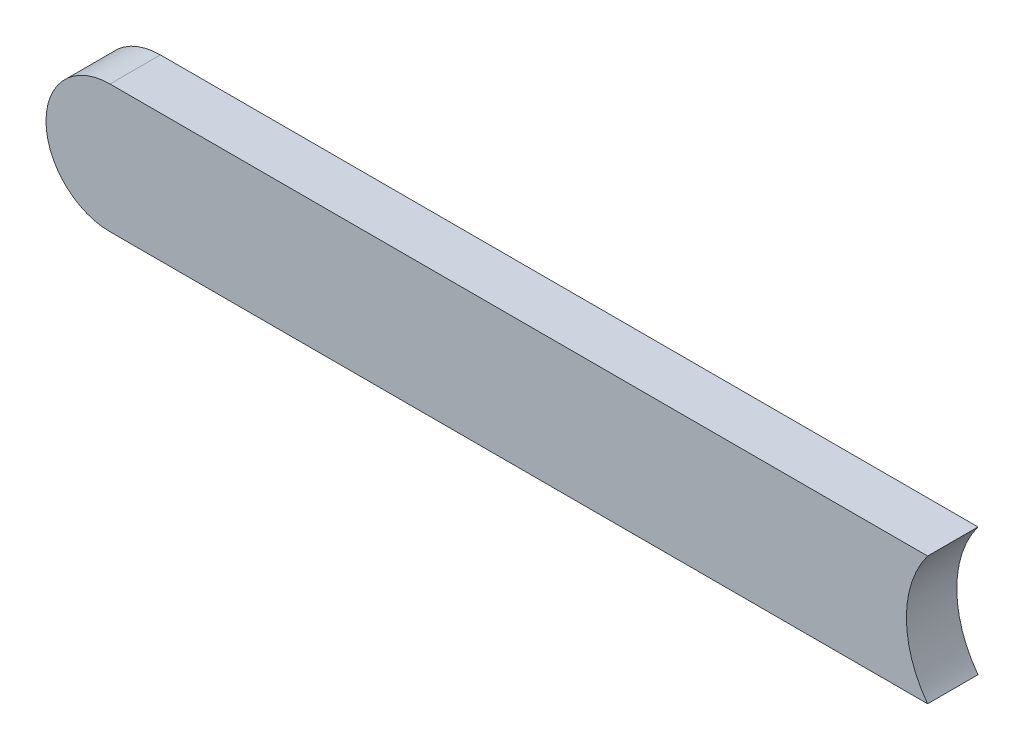
ISO-10303-21;
HEADER;
FILE_DESCRIPTION(('STEP AP214'),'2;1');
FILE_NAME('part.step','',(''),(''),'','','');
FILE_SCHEMA(('AUTOMOTIVE_DESIGN { 1 0 10303 214 1 1 1 1 }'));
ENDSEC;
DATA;
#1=APPLICATION_CONTEXT('core data for automotive mechanical design processes');
#2=APPLICATION_PROTOCOL_DEFINITION('international standard','automotive_design',2000,#1);
#3=PRODUCT_CONTEXT('',#1,'mechanical');
#4=PRODUCT('Part','Part','',(#3));
#5=PRODUCT_RELATED_PRODUCT_CATEGORY('part','',(#4));
#6=PRODUCT_DEFINITION_FORMATION('','',#4);
#7=PRODUCT_DEFINITION_CONTEXT('part definition',#1,'design');
#8=PRODUCT_DEFINITION('design','',#6,#7);
#9=PRODUCT_DEFINITION_SHAPE('','',#8);
#10=(LENGTH_UNIT() NAMED_UNIT(*) SI_UNIT(.MILLI.,.METRE.));
#11=(NAMED_UNIT(*) PLANE_ANGLE_UNIT() SI_UNIT($,.RADIAN.));
#12=(NAMED_UNIT(*) SI_UNIT($,.STERADIAN.) SOLID_ANGLE_UNIT());
#13=UNCERTAINTY_MEASURE_WITH_UNIT(LENGTH_MEASURE(1.E-05),#10,'distance_accuracy_value','');
#14=(GEOMETRIC_REPRESENTATION_CONTEXT(3) GLOBAL_UNCERTAINTY_ASSIGNED_CONTEXT((#13)) GLOBAL_UNIT_ASSIGNED_CONTEXT((#10,
#11,#12)) REPRESENTATION_CONTEXT('',''));
#15=CARTESIAN_POINT('',(0.,0.,0.));
#16=DIRECTION('',(0.,0.,1.));
#17=DIRECTION('',(1.,0.,0.));
#18=AXIS2_PLACEMENT_3D('',#15,#16,#17);
#19=CARTESIAN_POINT('',(146.782028,111.916972,0.));
#20=DIRECTION('',(0.,1.,0.));
#21=DIRECTION('',(1.,0.,0.));
#22=AXIS2_PLACEMENT_3D('',#19,#20,#21);
#23=PLANE('',#22);
#24=DIRECTION('',(1.,0.,0.));
#25=VECTOR('',#24,1.);
#26=CARTESIAN_POINT('',(146.782028,111.916972,0.1999996));
#27=LINE('',#26,#25);
#28=CARTESIAN_POINT('',(146.782028,111.916972,0.1999996));
#29=VERTEX_POINT('',#28);
#30=CARTESIAN_POINT('',(150.027251768896,111.916972,0.1999996));
#31=VERTEX_POINT('',#30);
#32=EDGE_CURVE('E11',#29,#31,#27,.T.);
#33=ORIENTED_EDGE('',*,*,#32,.F.);
#34=DIRECTION('',(0.,0.,1.));
#35=VECTOR('',#34,1.);
#36=CARTESIAN_POINT('',(146.782028,111.916972,0.));
#37=LINE('',#36,#35);
#38=CARTESIAN_POINT('',(146.782028,111.916972,0.));
#39=VERTEX_POINT('',#38);
#40=EDGE_CURVE('E24',#39,#29,#37,.T.);
#41=ORIENTED_EDGE('',*,*,#40,.F.);
#42=DIRECTION('',(1.,0.,0.));
#43=VECTOR('',#42,1.);
#44=CARTESIAN_POINT('',(146.782028,111.916972,0.));
#45=LINE('',#44,#43);
#46=CARTESIAN_POINT('',(150.027251768896,111.916972,0.));
#47=VERTEX_POINT('',#46);
#48=EDGE_CURVE('E75',#39,#47,#45,.T.);
#49=ORIENTED_EDGE('',*,*,#48,.T.);
#50=DIRECTION('',(0.,0.,1.));
#51=VECTOR('',#50,1.);
#52=CARTESIAN_POINT('',(150.027251768896,111.916972,0.));
#53=LINE('',#52,#51);
#54=EDGE_CURVE('E37',#47,#31,#53,.T.);
#55=ORIENTED_EDGE('',*,*,#54,.T.);
#56=EDGE_LOOP('',(#33,#41,#49,#55));
#57=FACE_BOUND('',#56,.T.);
#58=ADVANCED_FACE('F17',(#57),#23,.F.);
#59=CARTESIAN_POINT('',(150.368,112.170972,0.));
#60=DIRECTION('',(0.,0.,-1.));
#61=DIRECTION('',(1.,0.,0.));
#62=AXIS2_PLACEMENT_3D('',#59,#60,#61);
#63=CYLINDRICAL_SURFACE('',#62,0.42500042);
#64=DIRECTION('',(0.,0.,1.));
#65=VECTOR('',#64,1.);
#66=CARTESIAN_POINT('',(150.027251768896,112.424972,0.));
#67=LINE('',#66,#65);
#68=CARTESIAN_POINT('',(150.027251768896,112.424972,0.));
#69=VERTEX_POINT('',#68);
#70=CARTESIAN_POINT('',(150.027251768896,112.424972,0.1999996));
#71=VERTEX_POINT('',#70);
#72=EDGE_CURVE('E67',#69,#71,#67,.T.);
#73=ORIENTED_EDGE('',*,*,#72,.T.);
#74=CARTESIAN_POINT('',(150.368,112.170972,0.1999996));
#75=DIRECTION('',(0.,0.,1.));
#76=DIRECTION('',(1.,0.,0.));
#77=AXIS2_PLACEMENT_3D('',#74,#75,#76);
#78=CIRCLE('',#77,0.42500042);
#79=EDGE_CURVE('E82',#71,#31,#78,.T.);
#80=ORIENTED_EDGE('',*,*,#79,.T.);
#81=ORIENTED_EDGE('',*,*,#54,.F.);
#82=CARTESIAN_POINT('',(150.368,112.170972,0.));
#83=DIRECTION('',(0.,0.,1.));
#84=DIRECTION('',(1.,0.,0.));
#85=AXIS2_PLACEMENT_3D('',#82,#83,#84);
#86=CIRCLE('',#85,0.42500042);
#87=EDGE_CURVE('E80',#69,#47,#86,.T.);
#88=ORIENTED_EDGE('',*,*,#87,.F.);
#89=EDGE_LOOP('',(#73,#80,#81,#88));
#90=FACE_BOUND('',#89,.T.);
#91=ADVANCED_FACE('F88',(#90),#63,.F.);
#92=CARTESIAN_POINT('',(150.027251768896,112.424972,0.));
#93=DIRECTION('',(0.,-1.,0.));
#94=DIRECTION('',(-1.,0.,0.));
#95=AXIS2_PLACEMENT_3D('',#92,#93,#94);
#96=PLANE('',#95);
#97=DIRECTION('',(-1.,0.,0.));
#98=VECTOR('',#97,1.);
#99=CARTESIAN_POINT('',(150.368,112.424972,0.1999996));
#100=LINE('',#99,#98);
#101=CARTESIAN_POINT('',(146.782028,112.424972,0.1999996));
#102=VERTEX_POINT('',#101);
#103=EDGE_CURVE('E71',#71,#102,#100,.T.);
#104=ORIENTED_EDGE('',*,*,#103,.F.);
#105=ORIENTED_EDGE('',*,*,#72,.F.);
#106=DIRECTION('',(-1.,0.,0.));
#107=VECTOR('',#106,1.);
#108=CARTESIAN_POINT('',(150.368,112.424972,0.));
#109=LINE('',#108,#107);
#110=CARTESIAN_POINT('',(146.782028,112.424972,0.));
#111=VERTEX_POINT('',#110);
#112=EDGE_CURVE('E63',#69,#111,#109,.T.);
#113=ORIENTED_EDGE('',*,*,#112,.T.);
#114=DIRECTION('',(0.,0.,1.));
#115=VECTOR('',#114,1.);
#116=CARTESIAN_POINT('',(146.782028,112.424972,0.));
#117=LINE('',#116,#115);
#118=EDGE_CURVE('E53',#111,#102,#117,.T.);
#119=ORIENTED_EDGE('',*,*,#118,.T.);
#120=EDGE_LOOP('',(#104,#105,#113,#119));
#121=FACE_BOUND('',#120,.T.);
#122=ADVANCED_FACE('F66',(#121),#96,.F.);
#123=CARTESIAN_POINT('',(146.782028,112.170972,0.));
#124=DIRECTION('',(0.,0.,-1.));
#125=DIRECTION('',(-1.11896493820486E-13,1.,0.));
#126=AXIS2_PLACEMENT_3D('',#123,#124,#125);
#127=CYLINDRICAL_SURFACE('',#126,0.254000000000005);
#128=CARTESIAN_POINT('',(146.782028,112.170972,0.1999996));
#129=DIRECTION('',(0.,0.,1.));
#130=DIRECTION('',(-1.11896493820486E-13,1.,0.));
#131=AXIS2_PLACEMENT_3D('',#128,#129,#130);
#132=CIRCLE('',#131,0.254000000000005);
#133=EDGE_CURVE('E59',#102,#29,#132,.T.);
#134=ORIENTED_EDGE('',*,*,#133,.F.);
#135=ORIENTED_EDGE('',*,*,#118,.F.);
#136=CARTESIAN_POINT('',(146.782028,112.170972,0.));
#137=DIRECTION('',(0.,0.,1.));
#138=DIRECTION('',(-1.11896493820486E-13,1.,0.));
#139=AXIS2_PLACEMENT_3D('',#136,#137,#138);
#140=CIRCLE('',#139,0.254000000000005);
#141=EDGE_CURVE('E57',#111,#39,#140,.T.);
#142=ORIENTED_EDGE('',*,*,#141,.T.);
#143=ORIENTED_EDGE('',*,*,#40,.T.);
#144=EDGE_LOOP('',(#134,#135,#142,#143));
#145=FACE_BOUND('',#144,.T.);
#146=ADVANCED_FACE('F55',(#145),#127,.T.);
#147=CARTESIAN_POINT('',(146.782028,111.916972,0.));
#148=DIRECTION('',(0.,0.,-1.));
#149=DIRECTION('',(-1.,0.,0.));
#150=AXIS2_PLACEMENT_3D('',#147,#148,#149);
#151=PLANE('',#150);
#152=ORIENTED_EDGE('',*,*,#48,.F.);
#153=ORIENTED_EDGE('',*,*,#141,.F.);
#154=ORIENTED_EDGE('',*,*,#112,.F.);
#155=ORIENTED_EDGE('',*,*,#87,.T.);
#156=EDGE_LOOP('',(#152,#153,#154,#155));
#157=FACE_BOUND('',#156,.T.);
#158=ADVANCED_FACE('F74',(#157),#151,.T.);
#159=CARTESIAN_POINT('',(146.782028,111.916972,0.1999996));
#160=DIRECTION('',(0.,0.,-1.));
#161=DIRECTION('',(-1.,0.,0.));
#162=AXIS2_PLACEMENT_3D('',#159,#160,#161);
#163=PLANE('',#162);
#164=ORIENTED_EDGE('',*,*,#133,.T.);
#165=ORIENTED_EDGE('',*,*,#32,.T.);
#166=ORIENTED_EDGE('',*,*,#79,.F.);
#167=ORIENTED_EDGE('',*,*,#103,.T.);
#168=EDGE_LOOP('',(#164,#165,#166,#167));
#169=FACE_BOUND('',#168,.T.);
#170=ADVANCED_FACE('F91',(#169),#163,.F.);
#171=CLOSED_SHELL('',(#58,#91,#122,#146,#158,#170));
#172=MANIFOLD_SOLID_BREP('B1',#171);
#173=ADVANCED_BREP_SHAPE_REPRESENTATION('',(#18,#172),#14);
#174=SHAPE_DEFINITION_REPRESENTATION(#9,#173);
ENDSEC;
END-ISO-10303-21;
